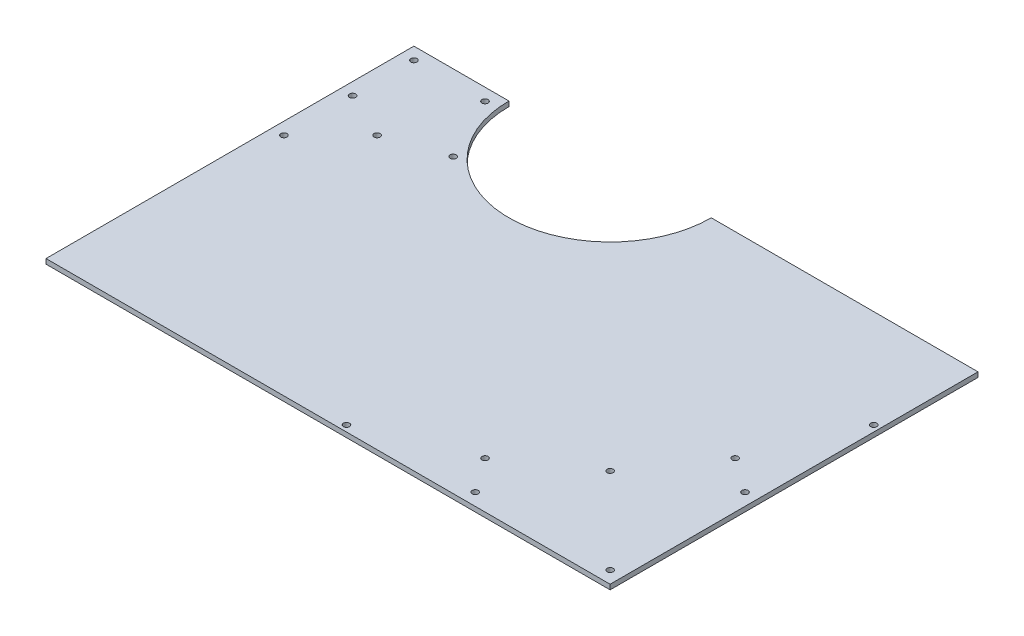
ISO-10303-21;
HEADER;
FILE_DESCRIPTION(('STEP AP214'),'2;1');
FILE_NAME('part.step','',(''),(''),'','','');
FILE_SCHEMA(('AUTOMOTIVE_DESIGN { 1 0 10303 214 1 1 1 1 }'));
ENDSEC;
DATA;
#1=APPLICATION_CONTEXT('core data for automotive mechanical design processes');
#2=APPLICATION_PROTOCOL_DEFINITION('international standard','automotive_design',2000,#1);
#3=PRODUCT_CONTEXT('',#1,'mechanical');
#4=PRODUCT('Part','Part','',(#3));
#5=PRODUCT_RELATED_PRODUCT_CATEGORY('part','',(#4));
#6=PRODUCT_DEFINITION_FORMATION('','',#4);
#7=PRODUCT_DEFINITION_CONTEXT('part definition',#1,'design');
#8=PRODUCT_DEFINITION('design','',#6,#7);
#9=PRODUCT_DEFINITION_SHAPE('','',#8);
#10=(LENGTH_UNIT() NAMED_UNIT(*) SI_UNIT(.MILLI.,.METRE.));
#11=(NAMED_UNIT(*) PLANE_ANGLE_UNIT() SI_UNIT($,.RADIAN.));
#12=(NAMED_UNIT(*) SI_UNIT($,.STERADIAN.) SOLID_ANGLE_UNIT());
#13=UNCERTAINTY_MEASURE_WITH_UNIT(LENGTH_MEASURE(1.E-05),#10,'distance_accuracy_value','');
#14=(GEOMETRIC_REPRESENTATION_CONTEXT(3) GLOBAL_UNCERTAINTY_ASSIGNED_CONTEXT((#13)) GLOBAL_UNIT_ASSIGNED_CONTEXT((#10,
#11,#12)) REPRESENTATION_CONTEXT('',''));
#15=CARTESIAN_POINT('',(0.,0.,0.));
#16=DIRECTION('',(0.,0.,1.));
#17=DIRECTION('',(1.,0.,0.));
#18=AXIS2_PLACEMENT_3D('',#15,#16,#17);
#19=CARTESIAN_POINT('',(-203.2,5.08,-381.));
#20=DIRECTION('',(1.,0.,0.));
#21=DIRECTION('',(0.,0.,-1.));
#22=AXIS2_PLACEMENT_3D('',#19,#20,#21);
#23=PLANE('',#22);
#24=DIRECTION('',(0.,0.,1.));
#25=VECTOR('',#24,1.);
#26=CARTESIAN_POINT('',(-203.2,0.,-381.));
#27=LINE('',#26,#25);
#28=CARTESIAN_POINT('',(-203.2,0.,-381.));
#29=VERTEX_POINT('',#28);
#30=CARTESIAN_POINT('',(-203.2,0.,0.));
#31=VERTEX_POINT('',#30);
#32=EDGE_CURVE('E106',#29,#31,#27,.T.);
#33=ORIENTED_EDGE('',*,*,#32,.T.);
#34=DIRECTION('',(0.,-1.,0.));
#35=VECTOR('',#34,1.);
#36=CARTESIAN_POINT('',(-203.2,5.08,0.));
#37=LINE('',#36,#35);
#38=CARTESIAN_POINT('',(-203.2,5.08,0.));
#39=VERTEX_POINT('',#38);
#40=EDGE_CURVE('E11',#39,#31,#37,.T.);
#41=ORIENTED_EDGE('',*,*,#40,.F.);
#42=DIRECTION('',(0.,0.,1.));
#43=VECTOR('',#42,1.);
#44=CARTESIAN_POINT('',(-203.2,5.08,-381.));
#45=LINE('',#44,#43);
#46=CARTESIAN_POINT('',(-203.2,5.08,-381.));
#47=VERTEX_POINT('',#46);
#48=EDGE_CURVE('E107',#47,#39,#45,.T.);
#49=ORIENTED_EDGE('',*,*,#48,.F.);
#50=DIRECTION('',(0.,-1.,0.));
#51=VECTOR('',#50,1.);
#52=CARTESIAN_POINT('',(-203.2,5.08,-381.));
#53=LINE('',#52,#51);
#54=EDGE_CURVE('E115',#47,#29,#53,.T.);
#55=ORIENTED_EDGE('',*,*,#54,.T.);
#56=EDGE_LOOP('',(#33,#41,#49,#55));
#57=FACE_BOUND('',#56,.T.);
#58=ADVANCED_FACE('F33',(#57),#23,.F.);
#59=CARTESIAN_POINT('',(-203.2,5.08,0.));
#60=DIRECTION('',(0.,0.,-1.));
#61=DIRECTION('',(-1.,0.,0.));
#62=AXIS2_PLACEMENT_3D('',#59,#60,#61);
#63=PLANE('',#62);
#64=DIRECTION('',(1.,0.,0.));
#65=VECTOR('',#64,1.);
#66=CARTESIAN_POINT('',(-203.2,0.,0.));
#67=LINE('',#66,#65);
#68=CARTESIAN_POINT('',(381.,0.,0.));
#69=VERTEX_POINT('',#68);
#70=EDGE_CURVE('E126',#31,#69,#67,.T.);
#71=ORIENTED_EDGE('',*,*,#70,.T.);
#72=DIRECTION('',(0.,-1.,0.));
#73=VECTOR('',#72,1.);
#74=CARTESIAN_POINT('',(381.,5.08,0.));
#75=LINE('',#74,#73);
#76=CARTESIAN_POINT('',(381.,5.08,0.));
#77=VERTEX_POINT('',#76);
#78=EDGE_CURVE('E40',#77,#69,#75,.T.);
#79=ORIENTED_EDGE('',*,*,#78,.F.);
#80=DIRECTION('',(1.,0.,0.));
#81=VECTOR('',#80,1.);
#82=CARTESIAN_POINT('',(-203.2,5.08,0.));
#83=LINE('',#82,#81);
#84=EDGE_CURVE('E85',#39,#77,#83,.T.);
#85=ORIENTED_EDGE('',*,*,#84,.F.);
#86=ORIENTED_EDGE('',*,*,#40,.T.);
#87=EDGE_LOOP('',(#71,#79,#85,#86));
#88=FACE_BOUND('',#87,.T.);
#89=ADVANCED_FACE('F270',(#88),#63,.F.);
#90=CARTESIAN_POINT('',(381.,5.08,-381.));
#91=DIRECTION('',(-1.,0.,0.));
#92=DIRECTION('',(0.,0.,1.));
#93=AXIS2_PLACEMENT_3D('',#90,#91,#92);
#94=PLANE('',#93);
#95=DIRECTION('',(0.,0.,-1.));
#96=VECTOR('',#95,1.);
#97=CARTESIAN_POINT('',(381.,0.,-381.));
#98=LINE('',#97,#96);
#99=CARTESIAN_POINT('',(381.,0.,-381.));
#100=VERTEX_POINT('',#99);
#101=EDGE_CURVE('E111',#69,#100,#98,.T.);
#102=ORIENTED_EDGE('',*,*,#101,.T.);
#103=DIRECTION('',(0.,-1.,0.));
#104=VECTOR('',#103,1.);
#105=CARTESIAN_POINT('',(381.,5.08,-381.));
#106=LINE('',#105,#104);
#107=CARTESIAN_POINT('',(381.,5.08,-381.));
#108=VERTEX_POINT('',#107);
#109=EDGE_CURVE('E117',#108,#100,#106,.T.);
#110=ORIENTED_EDGE('',*,*,#109,.F.);
#111=DIRECTION('',(0.,0.,-1.));
#112=VECTOR('',#111,1.);
#113=CARTESIAN_POINT('',(381.,5.08,-381.));
#114=LINE('',#113,#112);
#115=EDGE_CURVE('E125',#77,#108,#114,.T.);
#116=ORIENTED_EDGE('',*,*,#115,.F.);
#117=ORIENTED_EDGE('',*,*,#78,.T.);
#118=EDGE_LOOP('',(#102,#110,#116,#117));
#119=FACE_BOUND('',#118,.T.);
#120=ADVANCED_FACE('F123',(#119),#94,.F.);
#121=CARTESIAN_POINT('',(44.0205587624334,5.08,-381.));
#122=DIRECTION('',(0.,0.,1.));
#123=DIRECTION('',(1.,0.,0.));
#124=AXIS2_PLACEMENT_3D('',#121,#122,#123);
#125=PLANE('',#124);
#126=DIRECTION('',(-1.,0.,0.));
#127=VECTOR('',#126,1.);
#128=CARTESIAN_POINT('',(44.0205587624334,0.,-381.));
#129=LINE('',#128,#127);
#130=CARTESIAN_POINT('',(104.775,0.,-381.));
#131=VERTEX_POINT('',#130);
#132=EDGE_CURVE('E108',#100,#131,#129,.T.);
#133=ORIENTED_EDGE('',*,*,#132,.T.);
#134=DIRECTION('',(0.,-1.,0.));
#135=VECTOR('',#134,1.);
#136=CARTESIAN_POINT('',(104.775,50.8,-381.));
#137=LINE('',#136,#135);
#138=CARTESIAN_POINT('',(104.775,5.08,-381.));
#139=VERTEX_POINT('',#138);
#140=EDGE_CURVE('E47',#131,#139,#137,.F.);
#141=ORIENTED_EDGE('',*,*,#140,.T.);
#142=DIRECTION('',(-1.,0.,0.));
#143=VECTOR('',#142,1.);
#144=CARTESIAN_POINT('',(44.0205587624334,5.08,-381.));
#145=LINE('',#144,#143);
#146=EDGE_CURVE('E131',#108,#139,#145,.T.);
#147=ORIENTED_EDGE('',*,*,#146,.F.);
#148=ORIENTED_EDGE('',*,*,#109,.T.);
#149=EDGE_LOOP('',(#133,#141,#147,#148));
#150=FACE_BOUND('',#149,.T.);
#151=ADVANCED_FACE('F262',(#150),#125,.F.);
#152=CARTESIAN_POINT('',(-203.2,5.08,-381.));
#153=DIRECTION('',(0.,0.,1.));
#154=DIRECTION('',(1.,0.,0.));
#155=AXIS2_PLACEMENT_3D('',#152,#153,#154);
#156=PLANE('',#155);
#157=DIRECTION('',(-1.,0.,0.));
#158=VECTOR('',#157,1.);
#159=CARTESIAN_POINT('',(-203.2,5.08,-381.));
#160=LINE('',#159,#158);
#161=CARTESIAN_POINT('',(-104.775,5.08,-381.));
#162=VERTEX_POINT('',#161);
#163=EDGE_CURVE('E56',#162,#47,#160,.T.);
#164=ORIENTED_EDGE('',*,*,#163,.F.);
#165=DIRECTION('',(0.,-1.,0.));
#166=VECTOR('',#165,1.);
#167=CARTESIAN_POINT('',(-104.775,50.8,-381.));
#168=LINE('',#167,#166);
#169=CARTESIAN_POINT('',(-104.775,0.,-381.));
#170=VERTEX_POINT('',#169);
#171=EDGE_CURVE('E94',#162,#170,#168,.T.);
#172=ORIENTED_EDGE('',*,*,#171,.T.);
#173=DIRECTION('',(-1.,0.,0.));
#174=VECTOR('',#173,1.);
#175=CARTESIAN_POINT('',(-203.2,0.,-381.));
#176=LINE('',#175,#174);
#177=EDGE_CURVE('E78',#170,#29,#176,.T.);
#178=ORIENTED_EDGE('',*,*,#177,.T.);
#179=ORIENTED_EDGE('',*,*,#54,.F.);
#180=EDGE_LOOP('',(#164,#172,#178,#179));
#181=FACE_BOUND('',#180,.T.);
#182=ADVANCED_FACE('F101',(#181),#156,.F.);
#183=CARTESIAN_POINT('',(0.,5.08,0.));
#184=DIRECTION('',(0.,1.,0.));
#185=DIRECTION('',(0.,0.,1.));
#186=AXIS2_PLACEMENT_3D('',#183,#184,#185);
#187=PLANE('',#186);
#188=CARTESIAN_POINT('',(-190.5,5.08,-304.8));
#189=DIRECTION('',(0.,1.,0.));
#190=DIRECTION('',(0.,0.,1.));
#191=AXIS2_PLACEMENT_3D('',#188,#189,#190);
#192=CIRCLE('',#191,3.17499999999997);
#193=CARTESIAN_POINT('',(-190.5,5.08,-301.625));
#194=VERTEX_POINT('',#193);
#195=EDGE_CURVE('E216',#194,#194,#192,.T.);
#196=ORIENTED_EDGE('',*,*,#195,.F.);
#197=EDGE_LOOP('',(#196));
#198=FACE_BOUND('',#197,.T.);
#199=CARTESIAN_POINT('',(-190.5,5.08,-233.68));
#200=DIRECTION('',(0.,1.,0.));
#201=DIRECTION('',(0.,0.,1.));
#202=AXIS2_PLACEMENT_3D('',#199,#200,#201);
#203=CIRCLE('',#202,3.17499999999997);
#204=CARTESIAN_POINT('',(-190.5,5.08,-230.505));
#205=VERTEX_POINT('',#204);
#206=EDGE_CURVE('E210',#205,#205,#203,.T.);
#207=ORIENTED_EDGE('',*,*,#206,.F.);
#208=EDGE_LOOP('',(#207));
#209=FACE_BOUND('',#208,.T.);
#210=CARTESIAN_POINT('',(-142.24,5.08,-281.94));
#211=DIRECTION('',(0.,1.,0.));
#212=DIRECTION('',(0.,0.,1.));
#213=AXIS2_PLACEMENT_3D('',#210,#211,#212);
#214=CIRCLE('',#213,3.175);
#215=CARTESIAN_POINT('',(-142.24,5.08,-278.765));
#216=VERTEX_POINT('',#215);
#217=EDGE_CURVE('E204',#216,#216,#214,.T.);
#218=ORIENTED_EDGE('',*,*,#217,.F.);
#219=EDGE_LOOP('',(#218));
#220=FACE_BOUND('',#219,.T.);
#221=CARTESIAN_POINT('',(-83.82,5.08,-302.26));
#222=DIRECTION('',(0.,1.,0.));
#223=DIRECTION('',(0.,0.,1.));
#224=AXIS2_PLACEMENT_3D('',#221,#222,#223);
#225=CIRCLE('',#224,3.175);
#226=CARTESIAN_POINT('',(-83.82,5.08,-299.085));
#227=VERTEX_POINT('',#226);
#228=EDGE_CURVE('E198',#227,#227,#225,.T.);
#229=ORIENTED_EDGE('',*,*,#228,.F.);
#230=EDGE_LOOP('',(#229));
#231=FACE_BOUND('',#230,.T.);
#232=CARTESIAN_POINT('',(-116.84,5.08,-368.3));
#233=DIRECTION('',(0.,1.,0.));
#234=DIRECTION('',(0.,0.,1.));
#235=AXIS2_PLACEMENT_3D('',#232,#233,#234);
#236=CIRCLE('',#235,3.175);
#237=CARTESIAN_POINT('',(-116.84,5.08,-365.125));
#238=VERTEX_POINT('',#237);
#239=EDGE_CURVE('E192',#238,#238,#236,.T.);
#240=ORIENTED_EDGE('',*,*,#239,.F.);
#241=EDGE_LOOP('',(#240));
#242=FACE_BOUND('',#241,.T.);
#243=CARTESIAN_POINT('',(-190.5,5.08,-368.3));
#244=DIRECTION('',(0.,1.,0.));
#245=DIRECTION('',(0.,0.,1.));
#246=AXIS2_PLACEMENT_3D('',#243,#244,#245);
#247=CIRCLE('',#246,3.17499999999997);
#248=CARTESIAN_POINT('',(-190.5,5.08,-365.125));
#249=VERTEX_POINT('',#248);
#250=EDGE_CURVE('E186',#249,#249,#247,.T.);
#251=ORIENTED_EDGE('',*,*,#250,.F.);
#252=EDGE_LOOP('',(#251));
#253=FACE_BOUND('',#252,.T.);
#254=CARTESIAN_POINT('',(228.6,5.08,-12.7));
#255=DIRECTION('',(0.,1.,0.));
#256=DIRECTION('',(0.,0.,1.));
#257=AXIS2_PLACEMENT_3D('',#254,#255,#256);
#258=CIRCLE('',#257,3.17499999999997);
#259=CARTESIAN_POINT('',(228.6,5.08,-9.52500000000003));
#260=VERTEX_POINT('',#259);
#261=EDGE_CURVE('E180',#260,#260,#258,.T.);
#262=ORIENTED_EDGE('',*,*,#261,.F.);
#263=EDGE_LOOP('',(#262));
#264=FACE_BOUND('',#263,.T.);
#265=CARTESIAN_POINT('',(368.3,5.08,-12.7));
#266=DIRECTION('',(0.,1.,0.));
#267=DIRECTION('',(0.,0.,1.));
#268=AXIS2_PLACEMENT_3D('',#265,#266,#267);
#269=CIRCLE('',#268,3.17499999999997);
#270=CARTESIAN_POINT('',(368.3,5.08,-9.52500000000003));
#271=VERTEX_POINT('',#270);
#272=EDGE_CURVE('E174',#271,#271,#269,.T.);
#273=ORIENTED_EDGE('',*,*,#272,.F.);
#274=EDGE_LOOP('',(#273));
#275=FACE_BOUND('',#274,.T.);
#276=CARTESIAN_POINT('',(374.65,5.08,-279.4));
#277=DIRECTION('',(0.,1.,0.));
#278=DIRECTION('',(0.,0.,1.));
#279=AXIS2_PLACEMENT_3D('',#276,#277,#278);
#280=CIRCLE('',#279,3.17499999999997);
#281=CARTESIAN_POINT('',(374.65,5.08,-276.225));
#282=VERTEX_POINT('',#281);
#283=EDGE_CURVE('E168',#282,#282,#280,.T.);
#284=ORIENTED_EDGE('',*,*,#283,.F.);
#285=EDGE_LOOP('',(#284));
#286=FACE_BOUND('',#285,.T.);
#287=CARTESIAN_POINT('',(368.3,5.08,-152.4));
#288=DIRECTION('',(0.,1.,0.));
#289=DIRECTION('',(0.,0.,1.));
#290=AXIS2_PLACEMENT_3D('',#287,#288,#289);
#291=CIRCLE('',#290,3.17499999999997);
#292=CARTESIAN_POINT('',(368.3,5.08,-149.225));
#293=VERTEX_POINT('',#292);
#294=EDGE_CURVE('E162',#293,#293,#291,.T.);
#295=ORIENTED_EDGE('',*,*,#294,.F.);
#296=EDGE_LOOP('',(#295));
#297=FACE_BOUND('',#296,.T.);
#298=CARTESIAN_POINT('',(279.4,5.08,-101.6));
#299=DIRECTION('',(0.,1.,0.));
#300=DIRECTION('',(0.,0.,1.));
#301=AXIS2_PLACEMENT_3D('',#298,#299,#300);
#302=CIRCLE('',#301,3.17499999999997);
#303=CARTESIAN_POINT('',(279.4,5.08,-98.425));
#304=VERTEX_POINT('',#303);
#305=EDGE_CURVE('E156',#304,#304,#302,.T.);
#306=ORIENTED_EDGE('',*,*,#305,.F.);
#307=EDGE_LOOP('',(#306));
#308=FACE_BOUND('',#307,.T.);
#309=CARTESIAN_POINT('',(203.2,5.08,-48.26));
#310=DIRECTION('',(0.,1.,0.));
#311=DIRECTION('',(0.,0.,1.));
#312=AXIS2_PLACEMENT_3D('',#309,#310,#311);
#313=CIRCLE('',#312,3.175);
#314=CARTESIAN_POINT('',(203.2,5.08,-45.085));
#315=VERTEX_POINT('',#314);
#316=EDGE_CURVE('E150',#315,#315,#313,.T.);
#317=ORIENTED_EDGE('',*,*,#316,.F.);
#318=EDGE_LOOP('',(#317));
#319=FACE_BOUND('',#318,.T.);
#320=CARTESIAN_POINT('',(101.6,5.08,-6.35));
#321=DIRECTION('',(0.,1.,0.));
#322=DIRECTION('',(0.,0.,1.));
#323=AXIS2_PLACEMENT_3D('',#320,#321,#322);
#324=CIRCLE('',#323,3.175);
#325=CARTESIAN_POINT('',(101.6,5.08,-3.175));
#326=VERTEX_POINT('',#325);
#327=EDGE_CURVE('E144',#326,#326,#324,.T.);
#328=ORIENTED_EDGE('',*,*,#327,.F.);
#329=EDGE_LOOP('',(#328));
#330=FACE_BOUND('',#329,.T.);
#331=CARTESIAN_POINT('',(332.74,5.08,-177.8));
#332=DIRECTION('',(0.,1.,0.));
#333=DIRECTION('',(0.,0.,1.));
#334=AXIS2_PLACEMENT_3D('',#331,#332,#333);
#335=CIRCLE('',#334,3.17499999999997);
#336=CARTESIAN_POINT('',(332.74,5.08,-174.625));
#337=VERTEX_POINT('',#336);
#338=EDGE_CURVE('E138',#337,#337,#335,.T.);
#339=ORIENTED_EDGE('',*,*,#338,.F.);
#340=EDGE_LOOP('',(#339));
#341=FACE_BOUND('',#340,.T.);
#342=CARTESIAN_POINT('',(0.,5.08,-381.));
#343=DIRECTION('',(0.,1.,0.));
#344=DIRECTION('',(0.,0.,1.));
#345=AXIS2_PLACEMENT_3D('',#342,#343,#344);
#346=CIRCLE('',#345,104.775);
#347=EDGE_CURVE('E98',#162,#139,#346,.T.);
#348=ORIENTED_EDGE('',*,*,#347,.F.);
#349=ORIENTED_EDGE('',*,*,#163,.T.);
#350=ORIENTED_EDGE('',*,*,#48,.T.);
#351=ORIENTED_EDGE('',*,*,#84,.T.);
#352=ORIENTED_EDGE('',*,*,#115,.T.);
#353=ORIENTED_EDGE('',*,*,#146,.T.);
#354=EDGE_LOOP('',(#348,#349,#350,#351,#352,#353));
#355=FACE_BOUND('',#354,.T.);
#356=ADVANCED_FACE('F231',(#198,#209,#220,#231,#242,#253,#264,#275,#286,#297,#308,#319,#330,
#341,#355),#187,.T.);
#357=CARTESIAN_POINT('',(0.,0.,0.));
#358=DIRECTION('',(0.,1.,0.));
#359=DIRECTION('',(0.,0.,1.));
#360=AXIS2_PLACEMENT_3D('',#357,#358,#359);
#361=PLANE('',#360);
#362=CARTESIAN_POINT('',(-190.5,0.,-304.8));
#363=DIRECTION('',(0.,1.,0.));
#364=DIRECTION('',(0.,0.,1.));
#365=AXIS2_PLACEMENT_3D('',#362,#363,#364);
#366=CIRCLE('',#365,3.17499999999997);
#367=CARTESIAN_POINT('',(-190.5,0.,-301.625));
#368=VERTEX_POINT('',#367);
#369=EDGE_CURVE('E213',#368,#368,#366,.T.);
#370=ORIENTED_EDGE('',*,*,#369,.T.);
#371=EDGE_LOOP('',(#370));
#372=FACE_BOUND('',#371,.T.);
#373=CARTESIAN_POINT('',(-190.5,0.,-233.68));
#374=DIRECTION('',(0.,1.,0.));
#375=DIRECTION('',(0.,0.,1.));
#376=AXIS2_PLACEMENT_3D('',#373,#374,#375);
#377=CIRCLE('',#376,3.17499999999997);
#378=CARTESIAN_POINT('',(-190.5,0.,-230.505));
#379=VERTEX_POINT('',#378);
#380=EDGE_CURVE('E207',#379,#379,#377,.T.);
#381=ORIENTED_EDGE('',*,*,#380,.T.);
#382=EDGE_LOOP('',(#381));
#383=FACE_BOUND('',#382,.T.);
#384=CARTESIAN_POINT('',(-142.24,0.,-281.94));
#385=DIRECTION('',(0.,1.,0.));
#386=DIRECTION('',(0.,0.,1.));
#387=AXIS2_PLACEMENT_3D('',#384,#385,#386);
#388=CIRCLE('',#387,3.175);
#389=CARTESIAN_POINT('',(-142.24,0.,-278.765));
#390=VERTEX_POINT('',#389);
#391=EDGE_CURVE('E201',#390,#390,#388,.T.);
#392=ORIENTED_EDGE('',*,*,#391,.T.);
#393=EDGE_LOOP('',(#392));
#394=FACE_BOUND('',#393,.T.);
#395=CARTESIAN_POINT('',(-83.82,0.,-302.26));
#396=DIRECTION('',(0.,1.,0.));
#397=DIRECTION('',(0.,0.,1.));
#398=AXIS2_PLACEMENT_3D('',#395,#396,#397);
#399=CIRCLE('',#398,3.175);
#400=CARTESIAN_POINT('',(-83.82,0.,-299.085));
#401=VERTEX_POINT('',#400);
#402=EDGE_CURVE('E195',#401,#401,#399,.T.);
#403=ORIENTED_EDGE('',*,*,#402,.T.);
#404=EDGE_LOOP('',(#403));
#405=FACE_BOUND('',#404,.T.);
#406=CARTESIAN_POINT('',(-116.84,0.,-368.3));
#407=DIRECTION('',(0.,1.,0.));
#408=DIRECTION('',(0.,0.,1.));
#409=AXIS2_PLACEMENT_3D('',#406,#407,#408);
#410=CIRCLE('',#409,3.175);
#411=CARTESIAN_POINT('',(-116.84,0.,-365.125));
#412=VERTEX_POINT('',#411);
#413=EDGE_CURVE('E189',#412,#412,#410,.T.);
#414=ORIENTED_EDGE('',*,*,#413,.T.);
#415=EDGE_LOOP('',(#414));
#416=FACE_BOUND('',#415,.T.);
#417=CARTESIAN_POINT('',(-190.5,0.,-368.3));
#418=DIRECTION('',(0.,1.,0.));
#419=DIRECTION('',(0.,0.,1.));
#420=AXIS2_PLACEMENT_3D('',#417,#418,#419);
#421=CIRCLE('',#420,3.17499999999997);
#422=CARTESIAN_POINT('',(-190.5,0.,-365.125));
#423=VERTEX_POINT('',#422);
#424=EDGE_CURVE('E183',#423,#423,#421,.T.);
#425=ORIENTED_EDGE('',*,*,#424,.T.);
#426=EDGE_LOOP('',(#425));
#427=FACE_BOUND('',#426,.T.);
#428=CARTESIAN_POINT('',(228.6,0.,-12.7));
#429=DIRECTION('',(0.,1.,0.));
#430=DIRECTION('',(0.,0.,1.));
#431=AXIS2_PLACEMENT_3D('',#428,#429,#430);
#432=CIRCLE('',#431,3.17499999999997);
#433=CARTESIAN_POINT('',(228.6,0.,-9.52500000000003));
#434=VERTEX_POINT('',#433);
#435=EDGE_CURVE('E177',#434,#434,#432,.T.);
#436=ORIENTED_EDGE('',*,*,#435,.T.);
#437=EDGE_LOOP('',(#436));
#438=FACE_BOUND('',#437,.T.);
#439=CARTESIAN_POINT('',(368.3,0.,-12.7));
#440=DIRECTION('',(0.,1.,0.));
#441=DIRECTION('',(0.,0.,1.));
#442=AXIS2_PLACEMENT_3D('',#439,#440,#441);
#443=CIRCLE('',#442,3.17499999999997);
#444=CARTESIAN_POINT('',(368.3,0.,-9.52500000000003));
#445=VERTEX_POINT('',#444);
#446=EDGE_CURVE('E171',#445,#445,#443,.T.);
#447=ORIENTED_EDGE('',*,*,#446,.T.);
#448=EDGE_LOOP('',(#447));
#449=FACE_BOUND('',#448,.T.);
#450=CARTESIAN_POINT('',(374.65,0.,-279.4));
#451=DIRECTION('',(0.,1.,0.));
#452=DIRECTION('',(0.,0.,1.));
#453=AXIS2_PLACEMENT_3D('',#450,#451,#452);
#454=CIRCLE('',#453,3.17499999999997);
#455=CARTESIAN_POINT('',(374.65,0.,-276.225));
#456=VERTEX_POINT('',#455);
#457=EDGE_CURVE('E165',#456,#456,#454,.T.);
#458=ORIENTED_EDGE('',*,*,#457,.T.);
#459=EDGE_LOOP('',(#458));
#460=FACE_BOUND('',#459,.T.);
#461=CARTESIAN_POINT('',(368.3,0.,-152.4));
#462=DIRECTION('',(0.,1.,0.));
#463=DIRECTION('',(0.,0.,1.));
#464=AXIS2_PLACEMENT_3D('',#461,#462,#463);
#465=CIRCLE('',#464,3.17499999999997);
#466=CARTESIAN_POINT('',(368.3,0.,-149.225));
#467=VERTEX_POINT('',#466);
#468=EDGE_CURVE('E159',#467,#467,#465,.T.);
#469=ORIENTED_EDGE('',*,*,#468,.T.);
#470=EDGE_LOOP('',(#469));
#471=FACE_BOUND('',#470,.T.);
#472=CARTESIAN_POINT('',(279.4,0.,-101.6));
#473=DIRECTION('',(0.,1.,0.));
#474=DIRECTION('',(0.,0.,1.));
#475=AXIS2_PLACEMENT_3D('',#472,#473,#474);
#476=CIRCLE('',#475,3.17499999999997);
#477=CARTESIAN_POINT('',(279.4,0.,-98.425));
#478=VERTEX_POINT('',#477);
#479=EDGE_CURVE('E153',#478,#478,#476,.T.);
#480=ORIENTED_EDGE('',*,*,#479,.T.);
#481=EDGE_LOOP('',(#480));
#482=FACE_BOUND('',#481,.T.);
#483=CARTESIAN_POINT('',(203.2,0.,-48.26));
#484=DIRECTION('',(0.,1.,0.));
#485=DIRECTION('',(0.,0.,1.));
#486=AXIS2_PLACEMENT_3D('',#483,#484,#485);
#487=CIRCLE('',#486,3.175);
#488=CARTESIAN_POINT('',(203.2,0.,-45.085));
#489=VERTEX_POINT('',#488);
#490=EDGE_CURVE('E147',#489,#489,#487,.T.);
#491=ORIENTED_EDGE('',*,*,#490,.T.);
#492=EDGE_LOOP('',(#491));
#493=FACE_BOUND('',#492,.T.);
#494=CARTESIAN_POINT('',(101.6,0.,-6.35));
#495=DIRECTION('',(0.,1.,0.));
#496=DIRECTION('',(0.,0.,1.));
#497=AXIS2_PLACEMENT_3D('',#494,#495,#496);
#498=CIRCLE('',#497,3.175);
#499=CARTESIAN_POINT('',(101.6,0.,-3.175));
#500=VERTEX_POINT('',#499);
#501=EDGE_CURVE('E141',#500,#500,#498,.T.);
#502=ORIENTED_EDGE('',*,*,#501,.T.);
#503=EDGE_LOOP('',(#502));
#504=FACE_BOUND('',#503,.T.);
#505=CARTESIAN_POINT('',(332.74,0.,-177.8));
#506=DIRECTION('',(0.,1.,0.));
#507=DIRECTION('',(0.,0.,1.));
#508=AXIS2_PLACEMENT_3D('',#505,#506,#507);
#509=CIRCLE('',#508,3.17499999999997);
#510=CARTESIAN_POINT('',(332.74,0.,-174.625));
#511=VERTEX_POINT('',#510);
#512=EDGE_CURVE('E99',#511,#511,#509,.T.);
#513=ORIENTED_EDGE('',*,*,#512,.T.);
#514=EDGE_LOOP('',(#513));
#515=FACE_BOUND('',#514,.T.);
#516=ORIENTED_EDGE('',*,*,#177,.F.);
#517=CARTESIAN_POINT('',(0.,0.,-381.));
#518=DIRECTION('',(0.,-1.,0.));
#519=DIRECTION('',(0.,0.,-1.));
#520=AXIS2_PLACEMENT_3D('',#517,#518,#519);
#521=CIRCLE('',#520,104.775);
#522=EDGE_CURVE('E92',#131,#170,#521,.T.);
#523=ORIENTED_EDGE('',*,*,#522,.F.);
#524=ORIENTED_EDGE('',*,*,#132,.F.);
#525=ORIENTED_EDGE('',*,*,#101,.F.);
#526=ORIENTED_EDGE('',*,*,#70,.F.);
#527=ORIENTED_EDGE('',*,*,#32,.F.);
#528=EDGE_LOOP('',(#516,#523,#524,#525,#526,#527));
#529=FACE_BOUND('',#528,.T.);
#530=ADVANCED_FACE('F104',(#372,#383,#394,#405,#416,#427,#438,#449,#460,#471,#482,#493,#504,
#515,#529),#361,.F.);
#531=CARTESIAN_POINT('',(0.,50.8,-381.));
#532=DIRECTION('',(0.,-1.,0.));
#533=DIRECTION('',(0.,0.,-1.));
#534=AXIS2_PLACEMENT_3D('',#531,#532,#533);
#535=CYLINDRICAL_SURFACE('',#534,104.775);
#536=ORIENTED_EDGE('',*,*,#522,.T.);
#537=ORIENTED_EDGE('',*,*,#171,.F.);
#538=ORIENTED_EDGE('',*,*,#347,.T.);
#539=ORIENTED_EDGE('',*,*,#140,.F.);
#540=EDGE_LOOP('',(#536,#537,#538,#539));
#541=FACE_BOUND('',#540,.T.);
#542=ADVANCED_FACE('F93',(#541),#535,.F.);
#543=CARTESIAN_POINT('',(332.74,0.,-177.8));
#544=DIRECTION('',(0.,1.,0.));
#545=DIRECTION('',(0.,0.,1.));
#546=AXIS2_PLACEMENT_3D('',#543,#544,#545);
#547=CYLINDRICAL_SURFACE('',#546,3.17499999999997);
#548=ORIENTED_EDGE('',*,*,#512,.F.);
#549=EDGE_LOOP('',(#548));
#550=FACE_BOUND('',#549,.T.);
#551=ORIENTED_EDGE('',*,*,#338,.T.);
#552=EDGE_LOOP('',(#551));
#553=FACE_BOUND('',#552,.T.);
#554=ADVANCED_FACE('F305',(#550,#553),#547,.F.);
#555=CARTESIAN_POINT('',(101.6,0.,-6.35));
#556=DIRECTION('',(0.,1.,0.));
#557=DIRECTION('',(0.,0.,1.));
#558=AXIS2_PLACEMENT_3D('',#555,#556,#557);
#559=CYLINDRICAL_SURFACE('',#558,3.175);
#560=ORIENTED_EDGE('',*,*,#501,.F.);
#561=EDGE_LOOP('',(#560));
#562=FACE_BOUND('',#561,.T.);
#563=ORIENTED_EDGE('',*,*,#327,.T.);
#564=EDGE_LOOP('',(#563));
#565=FACE_BOUND('',#564,.T.);
#566=ADVANCED_FACE('F316',(#562,#565),#559,.F.);
#567=CARTESIAN_POINT('',(203.2,0.,-48.26));
#568=DIRECTION('',(0.,1.,0.));
#569=DIRECTION('',(0.,0.,1.));
#570=AXIS2_PLACEMENT_3D('',#567,#568,#569);
#571=CYLINDRICAL_SURFACE('',#570,3.175);
#572=ORIENTED_EDGE('',*,*,#490,.F.);
#573=EDGE_LOOP('',(#572));
#574=FACE_BOUND('',#573,.T.);
#575=ORIENTED_EDGE('',*,*,#316,.T.);
#576=EDGE_LOOP('',(#575));
#577=FACE_BOUND('',#576,.T.);
#578=ADVANCED_FACE('F326',(#574,#577),#571,.F.);
#579=CARTESIAN_POINT('',(279.4,0.,-101.6));
#580=DIRECTION('',(0.,1.,0.));
#581=DIRECTION('',(0.,0.,1.));
#582=AXIS2_PLACEMENT_3D('',#579,#580,#581);
#583=CYLINDRICAL_SURFACE('',#582,3.17499999999997);
#584=ORIENTED_EDGE('',*,*,#479,.F.);
#585=EDGE_LOOP('',(#584));
#586=FACE_BOUND('',#585,.T.);
#587=ORIENTED_EDGE('',*,*,#305,.T.);
#588=EDGE_LOOP('',(#587));
#589=FACE_BOUND('',#588,.T.);
#590=ADVANCED_FACE('F336',(#586,#589),#583,.F.);
#591=CARTESIAN_POINT('',(368.3,0.,-152.4));
#592=DIRECTION('',(0.,1.,0.));
#593=DIRECTION('',(0.,0.,1.));
#594=AXIS2_PLACEMENT_3D('',#591,#592,#593);
#595=CYLINDRICAL_SURFACE('',#594,3.17499999999997);
#596=ORIENTED_EDGE('',*,*,#468,.F.);
#597=EDGE_LOOP('',(#596));
#598=FACE_BOUND('',#597,.T.);
#599=ORIENTED_EDGE('',*,*,#294,.T.);
#600=EDGE_LOOP('',(#599));
#601=FACE_BOUND('',#600,.T.);
#602=ADVANCED_FACE('F346',(#598,#601),#595,.F.);
#603=CARTESIAN_POINT('',(374.65,0.,-279.4));
#604=DIRECTION('',(0.,1.,0.));
#605=DIRECTION('',(0.,0.,1.));
#606=AXIS2_PLACEMENT_3D('',#603,#604,#605);
#607=CYLINDRICAL_SURFACE('',#606,3.17499999999997);
#608=ORIENTED_EDGE('',*,*,#457,.F.);
#609=EDGE_LOOP('',(#608));
#610=FACE_BOUND('',#609,.T.);
#611=ORIENTED_EDGE('',*,*,#283,.T.);
#612=EDGE_LOOP('',(#611));
#613=FACE_BOUND('',#612,.T.);
#614=ADVANCED_FACE('F356',(#610,#613),#607,.F.);
#615=CARTESIAN_POINT('',(368.3,0.,-12.7));
#616=DIRECTION('',(0.,1.,0.));
#617=DIRECTION('',(0.,0.,1.));
#618=AXIS2_PLACEMENT_3D('',#615,#616,#617);
#619=CYLINDRICAL_SURFACE('',#618,3.17499999999997);
#620=ORIENTED_EDGE('',*,*,#446,.F.);
#621=EDGE_LOOP('',(#620));
#622=FACE_BOUND('',#621,.T.);
#623=ORIENTED_EDGE('',*,*,#272,.T.);
#624=EDGE_LOOP('',(#623));
#625=FACE_BOUND('',#624,.T.);
#626=ADVANCED_FACE('F366',(#622,#625),#619,.F.);
#627=CARTESIAN_POINT('',(228.6,0.,-12.7));
#628=DIRECTION('',(0.,1.,0.));
#629=DIRECTION('',(0.,0.,1.));
#630=AXIS2_PLACEMENT_3D('',#627,#628,#629);
#631=CYLINDRICAL_SURFACE('',#630,3.17499999999997);
#632=ORIENTED_EDGE('',*,*,#435,.F.);
#633=EDGE_LOOP('',(#632));
#634=FACE_BOUND('',#633,.T.);
#635=ORIENTED_EDGE('',*,*,#261,.T.);
#636=EDGE_LOOP('',(#635));
#637=FACE_BOUND('',#636,.T.);
#638=ADVANCED_FACE('F376',(#634,#637),#631,.F.);
#639=CARTESIAN_POINT('',(-190.5,0.,-368.3));
#640=DIRECTION('',(0.,1.,0.));
#641=DIRECTION('',(0.,0.,1.));
#642=AXIS2_PLACEMENT_3D('',#639,#640,#641);
#643=CYLINDRICAL_SURFACE('',#642,3.17499999999997);
#644=ORIENTED_EDGE('',*,*,#424,.F.);
#645=EDGE_LOOP('',(#644));
#646=FACE_BOUND('',#645,.T.);
#647=ORIENTED_EDGE('',*,*,#250,.T.);
#648=EDGE_LOOP('',(#647));
#649=FACE_BOUND('',#648,.T.);
#650=ADVANCED_FACE('F386',(#646,#649),#643,.F.);
#651=CARTESIAN_POINT('',(-116.84,0.,-368.3));
#652=DIRECTION('',(0.,1.,0.));
#653=DIRECTION('',(0.,0.,1.));
#654=AXIS2_PLACEMENT_3D('',#651,#652,#653);
#655=CYLINDRICAL_SURFACE('',#654,3.175);
#656=ORIENTED_EDGE('',*,*,#413,.F.);
#657=EDGE_LOOP('',(#656));
#658=FACE_BOUND('',#657,.T.);
#659=ORIENTED_EDGE('',*,*,#239,.T.);
#660=EDGE_LOOP('',(#659));
#661=FACE_BOUND('',#660,.T.);
#662=ADVANCED_FACE('F407',(#658,#661),#655,.F.);
#663=CARTESIAN_POINT('',(-83.82,0.,-302.26));
#664=DIRECTION('',(0.,1.,0.));
#665=DIRECTION('',(0.,0.,1.));
#666=AXIS2_PLACEMENT_3D('',#663,#664,#665);
#667=CYLINDRICAL_SURFACE('',#666,3.175);
#668=ORIENTED_EDGE('',*,*,#402,.F.);
#669=EDGE_LOOP('',(#668));
#670=FACE_BOUND('',#669,.T.);
#671=ORIENTED_EDGE('',*,*,#228,.T.);
#672=EDGE_LOOP('',(#671));
#673=FACE_BOUND('',#672,.T.);
#674=ADVANCED_FACE('F417',(#670,#673),#667,.F.);
#675=CARTESIAN_POINT('',(-142.24,0.,-281.94));
#676=DIRECTION('',(0.,1.,0.));
#677=DIRECTION('',(0.,0.,1.));
#678=AXIS2_PLACEMENT_3D('',#675,#676,#677);
#679=CYLINDRICAL_SURFACE('',#678,3.175);
#680=ORIENTED_EDGE('',*,*,#391,.F.);
#681=EDGE_LOOP('',(#680));
#682=FACE_BOUND('',#681,.T.);
#683=ORIENTED_EDGE('',*,*,#217,.T.);
#684=EDGE_LOOP('',(#683));
#685=FACE_BOUND('',#684,.T.);
#686=ADVANCED_FACE('F427',(#682,#685),#679,.F.);
#687=CARTESIAN_POINT('',(-190.5,0.,-233.68));
#688=DIRECTION('',(0.,1.,0.));
#689=DIRECTION('',(0.,0.,1.));
#690=AXIS2_PLACEMENT_3D('',#687,#688,#689);
#691=CYLINDRICAL_SURFACE('',#690,3.17499999999997);
#692=ORIENTED_EDGE('',*,*,#380,.F.);
#693=EDGE_LOOP('',(#692));
#694=FACE_BOUND('',#693,.T.);
#695=ORIENTED_EDGE('',*,*,#206,.T.);
#696=EDGE_LOOP('',(#695));
#697=FACE_BOUND('',#696,.T.);
#698=ADVANCED_FACE('F227',(#694,#697),#691,.F.);
#699=CARTESIAN_POINT('',(-190.5,0.,-304.8));
#700=DIRECTION('',(0.,1.,0.));
#701=DIRECTION('',(0.,0.,1.));
#702=AXIS2_PLACEMENT_3D('',#699,#700,#701);
#703=CYLINDRICAL_SURFACE('',#702,3.17499999999997);
#704=ORIENTED_EDGE('',*,*,#369,.F.);
#705=EDGE_LOOP('',(#704));
#706=FACE_BOUND('',#705,.T.);
#707=ORIENTED_EDGE('',*,*,#195,.T.);
#708=EDGE_LOOP('',(#707));
#709=FACE_BOUND('',#708,.T.);
#710=ADVANCED_FACE('F224',(#706,#709),#703,.F.);
#711=CLOSED_SHELL('',(#58,#89,#120,#151,#182,#356,#530,#542,#554,#566,#578,#590,#602,#614,#626,
#638,#650,#662,#674,#686,#698,#710));
#712=MANIFOLD_SOLID_BREP('B2',#711);
#713=ADVANCED_BREP_SHAPE_REPRESENTATION('',(#18,#712),#14);
#714=SHAPE_DEFINITION_REPRESENTATION(#9,#713);
ENDSEC;
END-ISO-10303-21;
